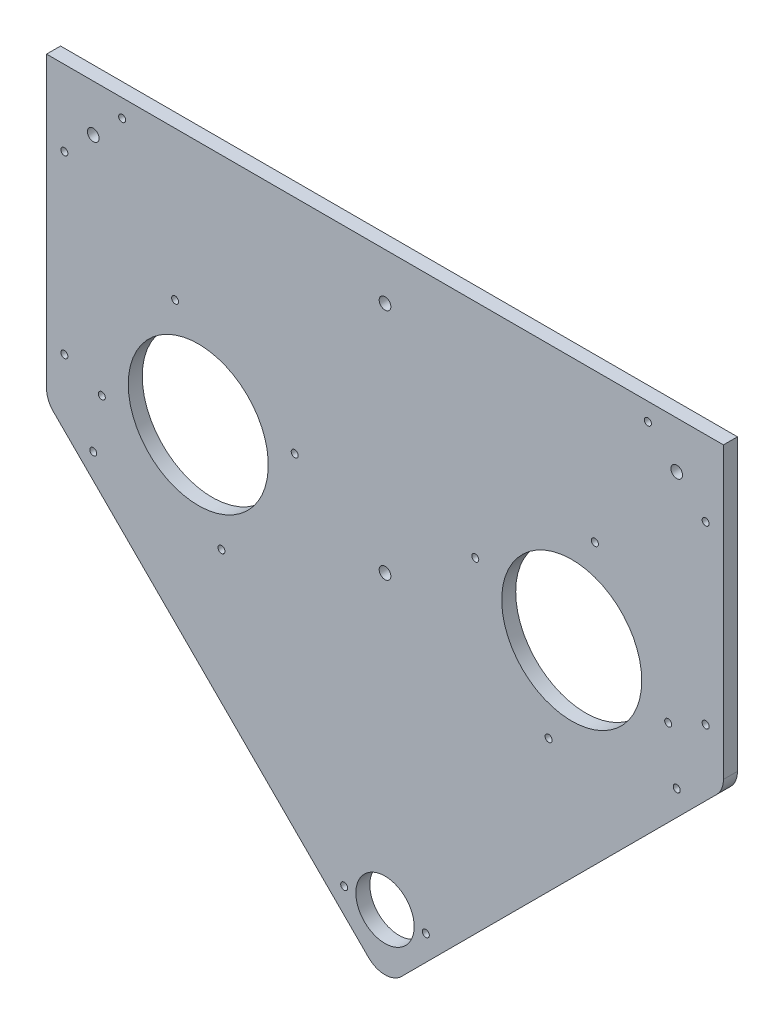
ISO-10303-21;
HEADER;
FILE_DESCRIPTION(('STEP AP214'),'2;1');
FILE_NAME('part.step','',(''),(''),'','','');
FILE_SCHEMA(('AUTOMOTIVE_DESIGN { 1 0 10303 214 1 1 1 1 }'));
ENDSEC;
DATA;
#1=APPLICATION_CONTEXT('core data for automotive mechanical design processes');
#2=APPLICATION_PROTOCOL_DEFINITION('international standard','automotive_design',2000,#1);
#3=PRODUCT_CONTEXT('',#1,'mechanical');
#4=PRODUCT('Part','Part','',(#3));
#5=PRODUCT_RELATED_PRODUCT_CATEGORY('part','',(#4));
#6=PRODUCT_DEFINITION_FORMATION('','',#4);
#7=PRODUCT_DEFINITION_CONTEXT('part definition',#1,'design');
#8=PRODUCT_DEFINITION('design','',#6,#7);
#9=PRODUCT_DEFINITION_SHAPE('','',#8);
#10=(LENGTH_UNIT() NAMED_UNIT(*) SI_UNIT(.MILLI.,.METRE.));
#11=(NAMED_UNIT(*) PLANE_ANGLE_UNIT() SI_UNIT($,.RADIAN.));
#12=(NAMED_UNIT(*) SI_UNIT($,.STERADIAN.) SOLID_ANGLE_UNIT());
#13=UNCERTAINTY_MEASURE_WITH_UNIT(LENGTH_MEASURE(1.E-05),#10,'distance_accuracy_value','');
#14=(GEOMETRIC_REPRESENTATION_CONTEXT(3) GLOBAL_UNCERTAINTY_ASSIGNED_CONTEXT((#13)) GLOBAL_UNIT_ASSIGNED_CONTEXT((#10,
#11,#12)) REPRESENTATION_CONTEXT('',''));
#15=CARTESIAN_POINT('',(0.,0.,0.));
#16=DIRECTION('',(0.,0.,1.));
#17=DIRECTION('',(1.,0.,0.));
#18=AXIS2_PLACEMENT_3D('',#15,#16,#17);
#19=CARTESIAN_POINT('',(0.,0.,6.));
#20=DIRECTION('',(0.,0.,-1.));
#21=DIRECTION('',(-1.,0.,0.));
#22=AXIS2_PLACEMENT_3D('',#19,#20,#21);
#23=PLANE('',#22);
#24=CARTESIAN_POINT('',(80.,15.,6.));
#25=DIRECTION('',(0.,0.,1.));
#26=DIRECTION('',(1.,0.,0.));
#27=AXIS2_PLACEMENT_3D('',#24,#25,#26);
#28=CIRCLE('',#27,30.);
#29=CARTESIAN_POINT('',(110.,15.,6.));
#30=VERTEX_POINT('',#29);
#31=EDGE_CURVE('E582',#30,#30,#28,.T.);
#32=ORIENTED_EDGE('',*,*,#31,.F.);
#33=EDGE_LOOP('',(#32));
#34=FACE_BOUND('',#33,.T.);
#35=CARTESIAN_POINT('',(-89.9203681970796,56.3259760300271,6.));
#36=DIRECTION('',(0.,0.,1.));
#37=DIRECTION('',(-1.,0.,0.));
#38=AXIS2_PLACEMENT_3D('',#35,#36,#37);
#39=CIRCLE('',#38,1.50000000000003);
#40=CARTESIAN_POINT('',(-91.4203681970796,56.3259760300271,6.));
#41=VERTEX_POINT('',#40);
#42=EDGE_CURVE('E580',#41,#41,#39,.T.);
#43=ORIENTED_EDGE('',*,*,#42,.F.);
#44=EDGE_LOOP('',(#43));
#45=FACE_BOUND('',#44,.T.);
#46=CARTESIAN_POINT('',(-70.0796318029204,-26.3259760300271,6.));
#47=DIRECTION('',(0.,0.,1.));
#48=DIRECTION('',(-1.,0.,0.));
#49=AXIS2_PLACEMENT_3D('',#46,#47,#48);
#50=CIRCLE('',#49,1.5);
#51=CARTESIAN_POINT('',(-71.5796318029204,-26.3259760300271,6.));
#52=VERTEX_POINT('',#51);
#53=EDGE_CURVE('E575',#52,#52,#50,.T.);
#54=ORIENTED_EDGE('',*,*,#53,.F.);
#55=EDGE_LOOP('',(#54));
#56=FACE_BOUND('',#55,.T.);
#57=CARTESIAN_POINT('',(-121.325976030027,5.07963180292047,6.));
#58=DIRECTION('',(0.,0.,1.));
#59=DIRECTION('',(-1.,0.,0.));
#60=AXIS2_PLACEMENT_3D('',#57,#58,#59);
#61=CIRCLE('',#60,1.5);
#62=CARTESIAN_POINT('',(-122.825976030027,5.07963180292047,6.));
#63=VERTEX_POINT('',#62);
#64=EDGE_CURVE('E571',#63,#63,#61,.T.);
#65=ORIENTED_EDGE('',*,*,#64,.F.);
#66=EDGE_LOOP('',(#65));
#67=FACE_BOUND('',#66,.T.);
#68=CARTESIAN_POINT('',(38.6740239699729,24.9203681970796,6.));
#69=DIRECTION('',(0.,0.,1.));
#70=DIRECTION('',(1.,0.,0.));
#71=AXIS2_PLACEMENT_3D('',#68,#69,#70);
#72=CIRCLE('',#71,1.50000000000003);
#73=CARTESIAN_POINT('',(40.1740239699729,24.9203681970796,6.));
#74=VERTEX_POINT('',#73);
#75=EDGE_CURVE('E598',#74,#74,#72,.T.);
#76=ORIENTED_EDGE('',*,*,#75,.F.);
#77=EDGE_LOOP('',(#76));
#78=FACE_BOUND('',#77,.T.);
#79=CARTESIAN_POINT('',(121.325976030027,5.07963180292047,6.));
#80=DIRECTION('',(0.,0.,1.));
#81=DIRECTION('',(1.,0.,0.));
#82=AXIS2_PLACEMENT_3D('',#79,#80,#81);
#83=CIRCLE('',#82,1.5);
#84=CARTESIAN_POINT('',(122.825976030027,5.07963180292047,6.));
#85=VERTEX_POINT('',#84);
#86=EDGE_CURVE('E594',#85,#85,#83,.T.);
#87=ORIENTED_EDGE('',*,*,#86,.F.);
#88=EDGE_LOOP('',(#87));
#89=FACE_BOUND('',#88,.T.);
#90=CARTESIAN_POINT('',(70.0796318029204,-26.3259760300271,6.));
#91=DIRECTION('',(0.,0.,1.));
#92=DIRECTION('',(1.,0.,0.));
#93=AXIS2_PLACEMENT_3D('',#90,#91,#92);
#94=CIRCLE('',#93,1.5);
#95=CARTESIAN_POINT('',(71.5796318029204,-26.3259760300271,6.));
#96=VERTEX_POINT('',#95);
#97=EDGE_CURVE('E590',#96,#96,#94,.T.);
#98=ORIENTED_EDGE('',*,*,#97,.F.);
#99=EDGE_LOOP('',(#98));
#100=FACE_BOUND('',#99,.T.);
#101=CARTESIAN_POINT('',(-38.6740239699729,24.9203681970796,6.));
#102=DIRECTION('',(0.,0.,1.));
#103=DIRECTION('',(-1.,0.,0.));
#104=AXIS2_PLACEMENT_3D('',#101,#102,#103);
#105=CIRCLE('',#104,1.50000000000003);
#106=CARTESIAN_POINT('',(-40.1740239699729,24.9203681970796,6.));
#107=VERTEX_POINT('',#106);
#108=EDGE_CURVE('E586',#107,#107,#105,.T.);
#109=ORIENTED_EDGE('',*,*,#108,.F.);
#110=EDGE_LOOP('',(#109));
#111=FACE_BOUND('',#110,.T.);
#112=CARTESIAN_POINT('',(-80.,15.,6.));
#113=DIRECTION('',(0.,0.,1.));
#114=DIRECTION('',(-1.,0.,0.));
#115=AXIS2_PLACEMENT_3D('',#112,#113,#114);
#116=CIRCLE('',#115,30.);
#117=CARTESIAN_POINT('',(-110.,15.,6.));
#118=VERTEX_POINT('',#117);
#119=EDGE_CURVE('E568',#118,#118,#116,.T.);
#120=ORIENTED_EDGE('',*,*,#119,.F.);
#121=EDGE_LOOP('',(#120));
#122=FACE_BOUND('',#121,.T.);
#123=CARTESIAN_POINT('',(89.9203681970796,56.3259760300271,6.));
#124=DIRECTION('',(0.,0.,1.));
#125=DIRECTION('',(1.,0.,0.));
#126=AXIS2_PLACEMENT_3D('',#123,#124,#125);
#127=CIRCLE('',#126,1.50000000000003);
#128=CARTESIAN_POINT('',(91.4203681970796,56.3259760300271,6.));
#129=VERTEX_POINT('',#128);
#130=EDGE_CURVE('E198',#129,#129,#127,.T.);
#131=ORIENTED_EDGE('',*,*,#130,.F.);
#132=EDGE_LOOP('',(#131));
#133=FACE_BOUND('',#132,.T.);
#134=DIRECTION('',(0.,-1.,0.));
#135=VECTOR('',#134,1.);
#136=CARTESIAN_POINT('',(-145.,-8.28427124746189,6.));
#137=LINE('',#136,#135);
#138=CARTESIAN_POINT('',(-145.,120.,6.));
#139=VERTEX_POINT('',#138);
#140=CARTESIAN_POINT('',(-145.,-4.14213562373095,6.));
#141=VERTEX_POINT('',#140);
#142=EDGE_CURVE('E159',#139,#141,#137,.T.);
#143=ORIENTED_EDGE('',*,*,#142,.T.);
#144=CARTESIAN_POINT('',(-135.,-4.14213562373095,6.));
#145=DIRECTION('',(0.,0.,-1.));
#146=DIRECTION('',(-1.,0.,0.));
#147=AXIS2_PLACEMENT_3D('',#144,#145,#146);
#148=CIRCLE('',#147,10.);
#149=CARTESIAN_POINT('',(-142.071067811865,-11.2132034355965,6.));
#150=VERTEX_POINT('',#149);
#151=EDGE_CURVE('E184',#141,#150,#148,.F.);
#152=ORIENTED_EDGE('',*,*,#151,.T.);
#153=DIRECTION('',(0.707106781186547,-0.707106781186547,0.));
#154=VECTOR('',#153,1.);
#155=CARTESIAN_POINT('',(0.,-153.284271247462,6.));
#156=LINE('',#155,#154);
#157=CARTESIAN_POINT('',(-7.07106781186548,-146.213203435596,6.));
#158=VERTEX_POINT('',#157);
#159=EDGE_CURVE('E359',#150,#158,#156,.T.);
#160=ORIENTED_EDGE('',*,*,#159,.T.);
#161=CARTESIAN_POINT('',(0.,-139.142135623731,6.));
#162=DIRECTION('',(0.,0.,-1.));
#163=DIRECTION('',(-1.,0.,0.));
#164=AXIS2_PLACEMENT_3D('',#161,#162,#163);
#165=CIRCLE('',#164,10.);
#166=CARTESIAN_POINT('',(7.07106781186545,-146.213203435596,6.));
#167=VERTEX_POINT('',#166);
#168=EDGE_CURVE('E179',#158,#167,#165,.F.);
#169=ORIENTED_EDGE('',*,*,#168,.T.);
#170=DIRECTION('',(0.707106781186548,0.707106781186547,0.));
#171=VECTOR('',#170,1.);
#172=CARTESIAN_POINT('',(145.,-8.28427124746206,6.));
#173=LINE('',#172,#171);
#174=CARTESIAN_POINT('',(142.071067811865,-11.2132034355966,6.));
#175=VERTEX_POINT('',#174);
#176=EDGE_CURVE('E121',#167,#175,#173,.T.);
#177=ORIENTED_EDGE('',*,*,#176,.T.);
#178=CARTESIAN_POINT('',(135.,-4.14213562373111,6.));
#179=DIRECTION('',(0.,0.,-1.));
#180=DIRECTION('',(-1.,0.,0.));
#181=AXIS2_PLACEMENT_3D('',#178,#179,#180);
#182=CIRCLE('',#181,10.);
#183=CARTESIAN_POINT('',(145.,-4.14213562373111,6.));
#184=VERTEX_POINT('',#183);
#185=EDGE_CURVE('E63',#175,#184,#182,.F.);
#186=ORIENTED_EDGE('',*,*,#185,.T.);
#187=DIRECTION('',(0.,1.,0.));
#188=VECTOR('',#187,1.);
#189=CARTESIAN_POINT('',(145.,120.,6.));
#190=LINE('',#189,#188);
#191=CARTESIAN_POINT('',(145.,120.,6.));
#192=VERTEX_POINT('',#191);
#193=EDGE_CURVE('E110',#184,#192,#190,.T.);
#194=ORIENTED_EDGE('',*,*,#193,.T.);
#195=DIRECTION('',(-1.,0.,0.));
#196=VECTOR('',#195,1.);
#197=CARTESIAN_POINT('',(-145.,120.,6.));
#198=LINE('',#197,#196);
#199=EDGE_CURVE('E115',#192,#139,#198,.T.);
#200=ORIENTED_EDGE('',*,*,#199,.T.);
#201=EDGE_LOOP('',(#143,#152,#160,#169,#177,#186,#194,#200));
#202=FACE_BOUND('',#201,.T.);
#203=CARTESIAN_POINT('',(-125.,100.,6.));
#204=DIRECTION('',(0.,0.,1.));
#205=DIRECTION('',(1.,0.,0.));
#206=AXIS2_PLACEMENT_3D('',#203,#204,#205);
#207=CIRCLE('',#206,2.5);
#208=CARTESIAN_POINT('',(-122.5,100.,6.));
#209=VERTEX_POINT('',#208);
#210=EDGE_CURVE('E148',#209,#209,#207,.T.);
#211=ORIENTED_EDGE('',*,*,#210,.F.);
#212=EDGE_LOOP('',(#211));
#213=FACE_BOUND('',#212,.T.);
#214=CARTESIAN_POINT('',(125.,100.,6.));
#215=DIRECTION('',(0.,0.,1.));
#216=DIRECTION('',(1.,0.,0.));
#217=AXIS2_PLACEMENT_3D('',#214,#215,#216);
#218=CIRCLE('',#217,2.49999999999998);
#219=CARTESIAN_POINT('',(127.5,100.,6.));
#220=VERTEX_POINT('',#219);
#221=EDGE_CURVE('E343',#220,#220,#218,.T.);
#222=ORIENTED_EDGE('',*,*,#221,.F.);
#223=EDGE_LOOP('',(#222));
#224=FACE_BOUND('',#223,.T.);
#225=CARTESIAN_POINT('',(0.,-125.,6.));
#226=DIRECTION('',(0.,0.,1.));
#227=DIRECTION('',(1.,0.,0.));
#228=AXIS2_PLACEMENT_3D('',#225,#226,#227);
#229=CIRCLE('',#228,12.5);
#230=CARTESIAN_POINT('',(12.5,-125.,6.));
#231=VERTEX_POINT('',#230);
#232=EDGE_CURVE('E335',#231,#231,#229,.T.);
#233=ORIENTED_EDGE('',*,*,#232,.F.);
#234=EDGE_LOOP('',(#233));
#235=FACE_BOUND('',#234,.T.);
#236=CARTESIAN_POINT('',(-112.625631329235,112.374368670765,6.));
#237=DIRECTION('',(0.,0.,1.));
#238=DIRECTION('',(1.,0.,0.));
#239=AXIS2_PLACEMENT_3D('',#236,#237,#238);
#240=CIRCLE('',#239,1.5);
#241=CARTESIAN_POINT('',(-111.125631329235,112.374368670765,6.));
#242=VERTEX_POINT('',#241);
#243=EDGE_CURVE('E327',#242,#242,#240,.T.);
#244=ORIENTED_EDGE('',*,*,#243,.F.);
#245=EDGE_LOOP('',(#244));
#246=FACE_BOUND('',#245,.T.);
#247=CARTESIAN_POINT('',(-137.374368670765,87.6256313292354,6.));
#248=DIRECTION('',(0.,0.,1.));
#249=DIRECTION('',(1.,0.,0.));
#250=AXIS2_PLACEMENT_3D('',#247,#248,#249);
#251=CIRCLE('',#250,1.5);
#252=CARTESIAN_POINT('',(-135.874368670765,87.6256313292354,6.));
#253=VERTEX_POINT('',#252);
#254=EDGE_CURVE('E319',#253,#253,#251,.T.);
#255=ORIENTED_EDGE('',*,*,#254,.F.);
#256=EDGE_LOOP('',(#255));
#257=FACE_BOUND('',#256,.T.);
#258=CARTESIAN_POINT('',(-137.374368670765,12.3743686707647,6.));
#259=DIRECTION('',(0.,0.,1.));
#260=DIRECTION('',(1.,0.,0.));
#261=AXIS2_PLACEMENT_3D('',#258,#259,#260);
#262=CIRCLE('',#261,1.5);
#263=CARTESIAN_POINT('',(-135.874368670765,12.3743686707647,6.));
#264=VERTEX_POINT('',#263);
#265=EDGE_CURVE('E311',#264,#264,#262,.T.);
#266=ORIENTED_EDGE('',*,*,#265,.F.);
#267=EDGE_LOOP('',(#266));
#268=FACE_BOUND('',#267,.T.);
#269=CARTESIAN_POINT('',(-125.,-17.5,6.));
#270=DIRECTION('',(0.,0.,1.));
#271=DIRECTION('',(1.,0.,0.));
#272=AXIS2_PLACEMENT_3D('',#269,#270,#271);
#273=CIRCLE('',#272,1.5);
#274=CARTESIAN_POINT('',(-123.5,-17.5,6.));
#275=VERTEX_POINT('',#274);
#276=EDGE_CURVE('E303',#275,#275,#273,.T.);
#277=ORIENTED_EDGE('',*,*,#276,.F.);
#278=EDGE_LOOP('',(#277));
#279=FACE_BOUND('',#278,.T.);
#280=CARTESIAN_POINT('',(-17.5,-125.,6.));
#281=DIRECTION('',(0.,0.,1.));
#282=DIRECTION('',(1.,0.,0.));
#283=AXIS2_PLACEMENT_3D('',#280,#281,#282);
#284=CIRCLE('',#283,1.5);
#285=CARTESIAN_POINT('',(-16.,-125.,6.));
#286=VERTEX_POINT('',#285);
#287=EDGE_CURVE('E295',#286,#286,#284,.T.);
#288=ORIENTED_EDGE('',*,*,#287,.F.);
#289=EDGE_LOOP('',(#288));
#290=FACE_BOUND('',#289,.T.);
#291=CARTESIAN_POINT('',(17.5,-125.,6.));
#292=DIRECTION('',(0.,0.,1.));
#293=DIRECTION('',(-1.,0.,0.));
#294=AXIS2_PLACEMENT_3D('',#291,#292,#293);
#295=CIRCLE('',#294,1.5);
#296=CARTESIAN_POINT('',(16.,-125.,6.));
#297=VERTEX_POINT('',#296);
#298=EDGE_CURVE('E287',#297,#297,#295,.T.);
#299=ORIENTED_EDGE('',*,*,#298,.F.);
#300=EDGE_LOOP('',(#299));
#301=FACE_BOUND('',#300,.T.);
#302=CARTESIAN_POINT('',(125.,-17.5,6.));
#303=DIRECTION('',(0.,0.,1.));
#304=DIRECTION('',(-1.,0.,0.));
#305=AXIS2_PLACEMENT_3D('',#302,#303,#304);
#306=CIRCLE('',#305,1.5);
#307=CARTESIAN_POINT('',(123.5,-17.5,6.));
#308=VERTEX_POINT('',#307);
#309=EDGE_CURVE('E279',#308,#308,#306,.T.);
#310=ORIENTED_EDGE('',*,*,#309,.F.);
#311=EDGE_LOOP('',(#310));
#312=FACE_BOUND('',#311,.T.);
#313=CARTESIAN_POINT('',(137.374368670765,12.3743686707647,6.));
#314=DIRECTION('',(0.,0.,1.));
#315=DIRECTION('',(-1.,0.,0.));
#316=AXIS2_PLACEMENT_3D('',#313,#314,#315);
#317=CIRCLE('',#316,1.5);
#318=CARTESIAN_POINT('',(135.874368670765,12.3743686707647,6.));
#319=VERTEX_POINT('',#318);
#320=EDGE_CURVE('E271',#319,#319,#317,.T.);
#321=ORIENTED_EDGE('',*,*,#320,.F.);
#322=EDGE_LOOP('',(#321));
#323=FACE_BOUND('',#322,.T.);
#324=CARTESIAN_POINT('',(137.374368670765,87.6256313292354,6.));
#325=DIRECTION('',(0.,0.,1.));
#326=DIRECTION('',(-1.,0.,0.));
#327=AXIS2_PLACEMENT_3D('',#324,#325,#326);
#328=CIRCLE('',#327,1.5);
#329=CARTESIAN_POINT('',(135.874368670765,87.6256313292354,6.));
#330=VERTEX_POINT('',#329);
#331=EDGE_CURVE('E263',#330,#330,#328,.T.);
#332=ORIENTED_EDGE('',*,*,#331,.F.);
#333=EDGE_LOOP('',(#332));
#334=FACE_BOUND('',#333,.T.);
#335=CARTESIAN_POINT('',(112.625631329235,112.374368670765,6.));
#336=DIRECTION('',(0.,0.,1.));
#337=DIRECTION('',(-1.,0.,0.));
#338=AXIS2_PLACEMENT_3D('',#335,#336,#337);
#339=CIRCLE('',#338,1.5);
#340=CARTESIAN_POINT('',(111.125631329235,112.374368670765,6.));
#341=VERTEX_POINT('',#340);
#342=EDGE_CURVE('E255',#341,#341,#339,.T.);
#343=ORIENTED_EDGE('',*,*,#342,.F.);
#344=EDGE_LOOP('',(#343));
#345=FACE_BOUND('',#344,.T.);
#346=CARTESIAN_POINT('',(0.,100.,6.));
#347=DIRECTION('',(0.,0.,1.));
#348=DIRECTION('',(1.,0.,0.));
#349=AXIS2_PLACEMENT_3D('',#346,#347,#348);
#350=CIRCLE('',#349,2.5);
#351=CARTESIAN_POINT('',(2.5,100.,6.));
#352=VERTEX_POINT('',#351);
#353=EDGE_CURVE('E247',#352,#352,#350,.T.);
#354=ORIENTED_EDGE('',*,*,#353,.F.);
#355=EDGE_LOOP('',(#354));
#356=FACE_BOUND('',#355,.T.);
#357=CARTESIAN_POINT('',(0.,0.,6.));
#358=DIRECTION('',(0.,0.,1.));
#359=DIRECTION('',(1.,0.,0.));
#360=AXIS2_PLACEMENT_3D('',#357,#358,#359);
#361=CIRCLE('',#360,2.5);
#362=CARTESIAN_POINT('',(2.5,0.,6.));
#363=VERTEX_POINT('',#362);
#364=EDGE_CURVE('E237',#363,#363,#361,.T.);
#365=ORIENTED_EDGE('',*,*,#364,.F.);
#366=EDGE_LOOP('',(#365));
#367=FACE_BOUND('',#366,.T.);
#368=ADVANCED_FACE('F45',(#34,#45,#56,#67,#78,#89,#100,#111,#122,#133,#202,#213,#224,#235,#246,
#257,#268,#279,#290,#301,#312,#323,#334,#345,#356,#367),#23,.F.);
#369=CARTESIAN_POINT('',(0.,0.,0.));
#370=DIRECTION('',(0.,0.,-1.));
#371=DIRECTION('',(-1.,0.,0.));
#372=AXIS2_PLACEMENT_3D('',#369,#370,#371);
#373=PLANE('',#372);
#374=CARTESIAN_POINT('',(80.,15.,0.));
#375=DIRECTION('',(0.,0.,-1.));
#376=DIRECTION('',(-1.,0.,0.));
#377=AXIS2_PLACEMENT_3D('',#374,#375,#376);
#378=CIRCLE('',#377,30.);
#379=CARTESIAN_POINT('',(50.,15.,0.));
#380=VERTEX_POINT('',#379);
#381=EDGE_CURVE('E49',#380,#380,#378,.T.);
#382=ORIENTED_EDGE('',*,*,#381,.F.);
#383=EDGE_LOOP('',(#382));
#384=FACE_BOUND('',#383,.T.);
#385=CARTESIAN_POINT('',(-89.9203681970796,56.3259760300271,0.));
#386=DIRECTION('',(0.,0.,-1.));
#387=DIRECTION('',(-1.,0.,0.));
#388=AXIS2_PLACEMENT_3D('',#385,#386,#387);
#389=CIRCLE('',#388,1.50000000000003);
#390=CARTESIAN_POINT('',(-91.4203681970796,56.3259760300271,0.));
#391=VERTEX_POINT('',#390);
#392=EDGE_CURVE('E225',#391,#391,#389,.T.);
#393=ORIENTED_EDGE('',*,*,#392,.F.);
#394=EDGE_LOOP('',(#393));
#395=FACE_BOUND('',#394,.T.);
#396=CARTESIAN_POINT('',(-70.0796318029204,-26.3259760300271,0.));
#397=DIRECTION('',(0.,0.,-1.));
#398=DIRECTION('',(-1.,0.,0.));
#399=AXIS2_PLACEMENT_3D('',#396,#397,#398);
#400=CIRCLE('',#399,1.5);
#401=CARTESIAN_POINT('',(-71.5796318029204,-26.3259760300271,0.));
#402=VERTEX_POINT('',#401);
#403=EDGE_CURVE('E222',#402,#402,#400,.T.);
#404=ORIENTED_EDGE('',*,*,#403,.F.);
#405=EDGE_LOOP('',(#404));
#406=FACE_BOUND('',#405,.T.);
#407=CARTESIAN_POINT('',(-121.325976030027,5.07963180292047,0.));
#408=DIRECTION('',(0.,0.,-1.));
#409=DIRECTION('',(-1.,0.,0.));
#410=AXIS2_PLACEMENT_3D('',#407,#408,#409);
#411=CIRCLE('',#410,1.5);
#412=CARTESIAN_POINT('',(-122.825976030027,5.07963180292047,0.));
#413=VERTEX_POINT('',#412);
#414=EDGE_CURVE('E218',#413,#413,#411,.T.);
#415=ORIENTED_EDGE('',*,*,#414,.F.);
#416=EDGE_LOOP('',(#415));
#417=FACE_BOUND('',#416,.T.);
#418=CARTESIAN_POINT('',(38.6740239699729,24.9203681970796,0.));
#419=DIRECTION('',(0.,0.,-1.));
#420=DIRECTION('',(-1.,0.,0.));
#421=AXIS2_PLACEMENT_3D('',#418,#419,#420);
#422=CIRCLE('',#421,1.50000000000003);
#423=CARTESIAN_POINT('',(37.1740239699729,24.9203681970796,0.));
#424=VERTEX_POINT('',#423);
#425=EDGE_CURVE('E214',#424,#424,#422,.T.);
#426=ORIENTED_EDGE('',*,*,#425,.F.);
#427=EDGE_LOOP('',(#426));
#428=FACE_BOUND('',#427,.T.);
#429=CARTESIAN_POINT('',(121.325976030027,5.07963180292047,0.));
#430=DIRECTION('',(0.,0.,-1.));
#431=DIRECTION('',(-1.,0.,0.));
#432=AXIS2_PLACEMENT_3D('',#429,#430,#431);
#433=CIRCLE('',#432,1.5);
#434=CARTESIAN_POINT('',(119.825976030027,5.07963180292047,0.));
#435=VERTEX_POINT('',#434);
#436=EDGE_CURVE('E210',#435,#435,#433,.T.);
#437=ORIENTED_EDGE('',*,*,#436,.F.);
#438=EDGE_LOOP('',(#437));
#439=FACE_BOUND('',#438,.T.);
#440=CARTESIAN_POINT('',(70.0796318029204,-26.3259760300271,0.));
#441=DIRECTION('',(0.,0.,-1.));
#442=DIRECTION('',(-1.,0.,0.));
#443=AXIS2_PLACEMENT_3D('',#440,#441,#442);
#444=CIRCLE('',#443,1.5);
#445=CARTESIAN_POINT('',(68.5796318029204,-26.3259760300271,0.));
#446=VERTEX_POINT('',#445);
#447=EDGE_CURVE('E206',#446,#446,#444,.T.);
#448=ORIENTED_EDGE('',*,*,#447,.F.);
#449=EDGE_LOOP('',(#448));
#450=FACE_BOUND('',#449,.T.);
#451=CARTESIAN_POINT('',(-38.6740239699729,24.9203681970796,0.));
#452=DIRECTION('',(0.,0.,-1.));
#453=DIRECTION('',(-1.,0.,0.));
#454=AXIS2_PLACEMENT_3D('',#451,#452,#453);
#455=CIRCLE('',#454,1.50000000000003);
#456=CARTESIAN_POINT('',(-40.1740239699729,24.9203681970796,0.));
#457=VERTEX_POINT('',#456);
#458=EDGE_CURVE('E202',#457,#457,#455,.T.);
#459=ORIENTED_EDGE('',*,*,#458,.F.);
#460=EDGE_LOOP('',(#459));
#461=FACE_BOUND('',#460,.T.);
#462=CARTESIAN_POINT('',(-80.,15.,0.));
#463=DIRECTION('',(0.,0.,-1.));
#464=DIRECTION('',(-1.,0.,0.));
#465=AXIS2_PLACEMENT_3D('',#462,#463,#464);
#466=CIRCLE('',#465,30.);
#467=CARTESIAN_POINT('',(-110.,15.,0.));
#468=VERTEX_POINT('',#467);
#469=EDGE_CURVE('E197',#468,#468,#466,.T.);
#470=ORIENTED_EDGE('',*,*,#469,.F.);
#471=EDGE_LOOP('',(#470));
#472=FACE_BOUND('',#471,.T.);
#473=CARTESIAN_POINT('',(89.9203681970796,56.3259760300271,0.));
#474=DIRECTION('',(0.,0.,-1.));
#475=DIRECTION('',(-1.,0.,0.));
#476=AXIS2_PLACEMENT_3D('',#473,#474,#475);
#477=CIRCLE('',#476,1.50000000000003);
#478=CARTESIAN_POINT('',(88.4203681970795,56.3259760300271,0.));
#479=VERTEX_POINT('',#478);
#480=EDGE_CURVE('E193',#479,#479,#477,.T.);
#481=ORIENTED_EDGE('',*,*,#480,.F.);
#482=EDGE_LOOP('',(#481));
#483=FACE_BOUND('',#482,.T.);
#484=CARTESIAN_POINT('',(0.,100.,0.));
#485=DIRECTION('',(0.,0.,1.));
#486=DIRECTION('',(1.,0.,0.));
#487=AXIS2_PLACEMENT_3D('',#484,#485,#486);
#488=CIRCLE('',#487,2.5);
#489=CARTESIAN_POINT('',(2.5,100.,0.));
#490=VERTEX_POINT('',#489);
#491=EDGE_CURVE('E243',#490,#490,#488,.T.);
#492=ORIENTED_EDGE('',*,*,#491,.T.);
#493=EDGE_LOOP('',(#492));
#494=FACE_BOUND('',#493,.T.);
#495=CARTESIAN_POINT('',(137.374368670765,87.6256313292354,0.));
#496=DIRECTION('',(0.,0.,1.));
#497=DIRECTION('',(-1.,0.,0.));
#498=AXIS2_PLACEMENT_3D('',#495,#496,#497);
#499=CIRCLE('',#498,1.5);
#500=CARTESIAN_POINT('',(135.874368670765,87.6256313292354,0.));
#501=VERTEX_POINT('',#500);
#502=EDGE_CURVE('E259',#501,#501,#499,.T.);
#503=ORIENTED_EDGE('',*,*,#502,.T.);
#504=EDGE_LOOP('',(#503));
#505=FACE_BOUND('',#504,.T.);
#506=CARTESIAN_POINT('',(125.,-17.5,0.));
#507=DIRECTION('',(0.,0.,1.));
#508=DIRECTION('',(-1.,0.,0.));
#509=AXIS2_PLACEMENT_3D('',#506,#507,#508);
#510=CIRCLE('',#509,1.5);
#511=CARTESIAN_POINT('',(123.5,-17.5,0.));
#512=VERTEX_POINT('',#511);
#513=EDGE_CURVE('E275',#512,#512,#510,.T.);
#514=ORIENTED_EDGE('',*,*,#513,.T.);
#515=EDGE_LOOP('',(#514));
#516=FACE_BOUND('',#515,.T.);
#517=CARTESIAN_POINT('',(-17.5,-125.,0.));
#518=DIRECTION('',(0.,0.,1.));
#519=DIRECTION('',(1.,0.,0.));
#520=AXIS2_PLACEMENT_3D('',#517,#518,#519);
#521=CIRCLE('',#520,1.5);
#522=CARTESIAN_POINT('',(-16.,-125.,0.));
#523=VERTEX_POINT('',#522);
#524=EDGE_CURVE('E291',#523,#523,#521,.T.);
#525=ORIENTED_EDGE('',*,*,#524,.T.);
#526=EDGE_LOOP('',(#525));
#527=FACE_BOUND('',#526,.T.);
#528=CARTESIAN_POINT('',(-137.374368670765,12.3743686707647,0.));
#529=DIRECTION('',(0.,0.,1.));
#530=DIRECTION('',(1.,0.,0.));
#531=AXIS2_PLACEMENT_3D('',#528,#529,#530);
#532=CIRCLE('',#531,1.5);
#533=CARTESIAN_POINT('',(-135.874368670765,12.3743686707647,0.));
#534=VERTEX_POINT('',#533);
#535=EDGE_CURVE('E307',#534,#534,#532,.T.);
#536=ORIENTED_EDGE('',*,*,#535,.T.);
#537=EDGE_LOOP('',(#536));
#538=FACE_BOUND('',#537,.T.);
#539=CARTESIAN_POINT('',(-112.625631329235,112.374368670765,0.));
#540=DIRECTION('',(0.,0.,1.));
#541=DIRECTION('',(1.,0.,0.));
#542=AXIS2_PLACEMENT_3D('',#539,#540,#541);
#543=CIRCLE('',#542,1.5);
#544=CARTESIAN_POINT('',(-111.125631329235,112.374368670765,0.));
#545=VERTEX_POINT('',#544);
#546=EDGE_CURVE('E323',#545,#545,#543,.T.);
#547=ORIENTED_EDGE('',*,*,#546,.T.);
#548=EDGE_LOOP('',(#547));
#549=FACE_BOUND('',#548,.T.);
#550=CARTESIAN_POINT('',(125.,100.,0.));
#551=DIRECTION('',(0.,0.,1.));
#552=DIRECTION('',(1.,0.,0.));
#553=AXIS2_PLACEMENT_3D('',#550,#551,#552);
#554=CIRCLE('',#553,2.49999999999998);
#555=CARTESIAN_POINT('',(127.5,100.,0.));
#556=VERTEX_POINT('',#555);
#557=EDGE_CURVE('E339',#556,#556,#554,.T.);
#558=ORIENTED_EDGE('',*,*,#557,.T.);
#559=EDGE_LOOP('',(#558));
#560=FACE_BOUND('',#559,.T.);
#561=DIRECTION('',(0.707106781186547,-0.707106781186547,0.));
#562=VECTOR('',#561,1.);
#563=CARTESIAN_POINT('',(0.,-153.284271247462,0.));
#564=LINE('',#563,#562);
#565=CARTESIAN_POINT('',(-142.071067811865,-11.2132034355965,0.));
#566=VERTEX_POINT('',#565);
#567=CARTESIAN_POINT('',(-7.07106781186548,-146.213203435596,0.));
#568=VERTEX_POINT('',#567);
#569=EDGE_CURVE('E147',#566,#568,#564,.T.);
#570=ORIENTED_EDGE('',*,*,#569,.F.);
#571=CARTESIAN_POINT('',(-135.,-4.14213562373095,0.));
#572=DIRECTION('',(0.,0.,-1.));
#573=DIRECTION('',(-1.,0.,0.));
#574=AXIS2_PLACEMENT_3D('',#571,#572,#573);
#575=CIRCLE('',#574,10.);
#576=CARTESIAN_POINT('',(-145.,-4.14213562373095,0.));
#577=VERTEX_POINT('',#576);
#578=EDGE_CURVE('E173',#566,#577,#575,.T.);
#579=ORIENTED_EDGE('',*,*,#578,.T.);
#580=DIRECTION('',(0.,-1.,0.));
#581=VECTOR('',#580,1.);
#582=CARTESIAN_POINT('',(-145.,-8.28427124746189,0.));
#583=LINE('',#582,#581);
#584=CARTESIAN_POINT('',(-145.,120.,0.));
#585=VERTEX_POINT('',#584);
#586=EDGE_CURVE('E143',#585,#577,#583,.T.);
#587=ORIENTED_EDGE('',*,*,#586,.F.);
#588=DIRECTION('',(-1.,0.,0.));
#589=VECTOR('',#588,1.);
#590=CARTESIAN_POINT('',(-145.,120.,0.));
#591=LINE('',#590,#589);
#592=CARTESIAN_POINT('',(145.,120.,0.));
#593=VERTEX_POINT('',#592);
#594=EDGE_CURVE('E157',#593,#585,#591,.T.);
#595=ORIENTED_EDGE('',*,*,#594,.F.);
#596=DIRECTION('',(0.,1.,0.));
#597=VECTOR('',#596,1.);
#598=CARTESIAN_POINT('',(145.,120.,0.));
#599=LINE('',#598,#597);
#600=CARTESIAN_POINT('',(145.,-4.14213562373111,0.));
#601=VERTEX_POINT('',#600);
#602=EDGE_CURVE('E127',#601,#593,#599,.T.);
#603=ORIENTED_EDGE('',*,*,#602,.F.);
#604=CARTESIAN_POINT('',(135.,-4.14213562373111,0.));
#605=DIRECTION('',(0.,0.,-1.));
#606=DIRECTION('',(-1.,0.,0.));
#607=AXIS2_PLACEMENT_3D('',#604,#605,#606);
#608=CIRCLE('',#607,10.);
#609=CARTESIAN_POINT('',(142.071067811865,-11.2132034355966,0.));
#610=VERTEX_POINT('',#609);
#611=EDGE_CURVE('E170',#601,#610,#608,.T.);
#612=ORIENTED_EDGE('',*,*,#611,.T.);
#613=DIRECTION('',(0.707106781186548,0.707106781186547,0.));
#614=VECTOR('',#613,1.);
#615=CARTESIAN_POINT('',(145.,-8.28427124746206,0.));
#616=LINE('',#615,#614);
#617=CARTESIAN_POINT('',(7.07106781186545,-146.213203435596,0.));
#618=VERTEX_POINT('',#617);
#619=EDGE_CURVE('E152',#618,#610,#616,.T.);
#620=ORIENTED_EDGE('',*,*,#619,.F.);
#621=CARTESIAN_POINT('',(0.,-139.142135623731,0.));
#622=DIRECTION('',(0.,0.,-1.));
#623=DIRECTION('',(-1.,0.,0.));
#624=AXIS2_PLACEMENT_3D('',#621,#622,#623);
#625=CIRCLE('',#624,10.);
#626=EDGE_CURVE('E167',#618,#568,#625,.T.);
#627=ORIENTED_EDGE('',*,*,#626,.T.);
#628=EDGE_LOOP('',(#570,#579,#587,#595,#603,#612,#620,#627));
#629=FACE_BOUND('',#628,.T.);
#630=CARTESIAN_POINT('',(-125.,100.,0.));
#631=DIRECTION('',(0.,0.,1.));
#632=DIRECTION('',(1.,0.,0.));
#633=AXIS2_PLACEMENT_3D('',#630,#631,#632);
#634=CIRCLE('',#633,2.5);
#635=CARTESIAN_POINT('',(-122.5,100.,0.));
#636=VERTEX_POINT('',#635);
#637=EDGE_CURVE('E347',#636,#636,#634,.T.);
#638=ORIENTED_EDGE('',*,*,#637,.T.);
#639=EDGE_LOOP('',(#638));
#640=FACE_BOUND('',#639,.T.);
#641=CARTESIAN_POINT('',(0.,-125.,0.));
#642=DIRECTION('',(0.,0.,1.));
#643=DIRECTION('',(1.,0.,0.));
#644=AXIS2_PLACEMENT_3D('',#641,#642,#643);
#645=CIRCLE('',#644,12.5);
#646=CARTESIAN_POINT('',(12.5,-125.,0.));
#647=VERTEX_POINT('',#646);
#648=EDGE_CURVE('E331',#647,#647,#645,.T.);
#649=ORIENTED_EDGE('',*,*,#648,.T.);
#650=EDGE_LOOP('',(#649));
#651=FACE_BOUND('',#650,.T.);
#652=CARTESIAN_POINT('',(-137.374368670765,87.6256313292354,0.));
#653=DIRECTION('',(0.,0.,1.));
#654=DIRECTION('',(1.,0.,0.));
#655=AXIS2_PLACEMENT_3D('',#652,#653,#654);
#656=CIRCLE('',#655,1.5);
#657=CARTESIAN_POINT('',(-135.874368670765,87.6256313292354,0.));
#658=VERTEX_POINT('',#657);
#659=EDGE_CURVE('E315',#658,#658,#656,.T.);
#660=ORIENTED_EDGE('',*,*,#659,.T.);
#661=EDGE_LOOP('',(#660));
#662=FACE_BOUND('',#661,.T.);
#663=CARTESIAN_POINT('',(-125.,-17.5,0.));
#664=DIRECTION('',(0.,0.,1.));
#665=DIRECTION('',(1.,0.,0.));
#666=AXIS2_PLACEMENT_3D('',#663,#664,#665);
#667=CIRCLE('',#666,1.5);
#668=CARTESIAN_POINT('',(-123.5,-17.5,0.));
#669=VERTEX_POINT('',#668);
#670=EDGE_CURVE('E299',#669,#669,#667,.T.);
#671=ORIENTED_EDGE('',*,*,#670,.T.);
#672=EDGE_LOOP('',(#671));
#673=FACE_BOUND('',#672,.T.);
#674=CARTESIAN_POINT('',(17.5,-125.,0.));
#675=DIRECTION('',(0.,0.,1.));
#676=DIRECTION('',(-1.,0.,0.));
#677=AXIS2_PLACEMENT_3D('',#674,#675,#676);
#678=CIRCLE('',#677,1.5);
#679=CARTESIAN_POINT('',(16.,-125.,0.));
#680=VERTEX_POINT('',#679);
#681=EDGE_CURVE('E283',#680,#680,#678,.T.);
#682=ORIENTED_EDGE('',*,*,#681,.T.);
#683=EDGE_LOOP('',(#682));
#684=FACE_BOUND('',#683,.T.);
#685=CARTESIAN_POINT('',(137.374368670765,12.3743686707647,0.));
#686=DIRECTION('',(0.,0.,1.));
#687=DIRECTION('',(-1.,0.,0.));
#688=AXIS2_PLACEMENT_3D('',#685,#686,#687);
#689=CIRCLE('',#688,1.5);
#690=CARTESIAN_POINT('',(135.874368670765,12.3743686707647,0.));
#691=VERTEX_POINT('',#690);
#692=EDGE_CURVE('E267',#691,#691,#689,.T.);
#693=ORIENTED_EDGE('',*,*,#692,.T.);
#694=EDGE_LOOP('',(#693));
#695=FACE_BOUND('',#694,.T.);
#696=CARTESIAN_POINT('',(112.625631329235,112.374368670765,0.));
#697=DIRECTION('',(0.,0.,1.));
#698=DIRECTION('',(-1.,0.,0.));
#699=AXIS2_PLACEMENT_3D('',#696,#697,#698);
#700=CIRCLE('',#699,1.5);
#701=CARTESIAN_POINT('',(111.125631329235,112.374368670765,0.));
#702=VERTEX_POINT('',#701);
#703=EDGE_CURVE('E251',#702,#702,#700,.T.);
#704=ORIENTED_EDGE('',*,*,#703,.T.);
#705=EDGE_LOOP('',(#704));
#706=FACE_BOUND('',#705,.T.);
#707=CARTESIAN_POINT('',(0.,0.,0.));
#708=DIRECTION('',(0.,0.,1.));
#709=DIRECTION('',(1.,0.,0.));
#710=AXIS2_PLACEMENT_3D('',#707,#708,#709);
#711=CIRCLE('',#710,2.5);
#712=CARTESIAN_POINT('',(2.5,0.,0.));
#713=VERTEX_POINT('',#712);
#714=EDGE_CURVE('E232',#713,#713,#711,.T.);
#715=ORIENTED_EDGE('',*,*,#714,.T.);
#716=EDGE_LOOP('',(#715));
#717=FACE_BOUND('',#716,.T.);
#718=ADVANCED_FACE('F369',(#384,#395,#406,#417,#428,#439,#450,#461,#472,#483,#494,#505,#516,
#527,#538,#549,#560,#629,#640,#651,#662,#673,#684,#695,#706,#717),#373,.T.);
#719=CARTESIAN_POINT('',(-145.,-8.28427124746189,6.));
#720=DIRECTION('',(1.,0.,0.));
#721=DIRECTION('',(0.,0.,-1.));
#722=AXIS2_PLACEMENT_3D('',#719,#720,#721);
#723=PLANE('',#722);
#724=ORIENTED_EDGE('',*,*,#586,.T.);
#725=DIRECTION('',(0.,0.,-1.));
#726=VECTOR('',#725,1.);
#727=CARTESIAN_POINT('',(-145.,-4.14213562373095,6.));
#728=LINE('',#727,#726);
#729=EDGE_CURVE('E176',#577,#141,#728,.F.);
#730=ORIENTED_EDGE('',*,*,#729,.T.);
#731=ORIENTED_EDGE('',*,*,#142,.F.);
#732=DIRECTION('',(0.,0.,-1.));
#733=VECTOR('',#732,1.);
#734=CARTESIAN_POINT('',(-145.,120.,6.));
#735=LINE('',#734,#733);
#736=EDGE_CURVE('E132',#139,#585,#735,.T.);
#737=ORIENTED_EDGE('',*,*,#736,.T.);
#738=EDGE_LOOP('',(#724,#730,#731,#737));
#739=FACE_BOUND('',#738,.T.);
#740=ADVANCED_FACE('F374',(#739),#723,.F.);
#741=CARTESIAN_POINT('',(0.,-153.284271247462,6.));
#742=DIRECTION('',(0.707106781186547,0.707106781186548,0.));
#743=DIRECTION('',(-0.707106781186548,0.707106781186547,0.));
#744=AXIS2_PLACEMENT_3D('',#741,#742,#743);
#745=PLANE('',#744);
#746=ORIENTED_EDGE('',*,*,#159,.F.);
#747=DIRECTION('',(0.,0.,-1.));
#748=VECTOR('',#747,1.);
#749=CARTESIAN_POINT('',(-142.071067811865,-11.2132034355964,6.));
#750=LINE('',#749,#748);
#751=EDGE_CURVE('E163',#150,#566,#750,.T.);
#752=ORIENTED_EDGE('',*,*,#751,.T.);
#753=ORIENTED_EDGE('',*,*,#569,.T.);
#754=DIRECTION('',(0.,0.,-1.));
#755=VECTOR('',#754,1.);
#756=CARTESIAN_POINT('',(-7.07106781186548,-146.213203435596,6.));
#757=LINE('',#756,#755);
#758=EDGE_CURVE('E131',#568,#158,#757,.F.);
#759=ORIENTED_EDGE('',*,*,#758,.T.);
#760=EDGE_LOOP('',(#746,#752,#753,#759));
#761=FACE_BOUND('',#760,.T.);
#762=ADVANCED_FACE('F382',(#761),#745,.F.);
#763=CARTESIAN_POINT('',(145.,-8.28427124746206,6.));
#764=DIRECTION('',(-0.707106781186547,0.707106781186548,0.));
#765=DIRECTION('',(-0.707106781186548,-0.707106781186547,0.));
#766=AXIS2_PLACEMENT_3D('',#763,#764,#765);
#767=PLANE('',#766);
#768=ORIENTED_EDGE('',*,*,#619,.T.);
#769=DIRECTION('',(0.,0.,-1.));
#770=VECTOR('',#769,1.);
#771=CARTESIAN_POINT('',(142.071067811865,-11.2132034355966,6.));
#772=LINE('',#771,#770);
#773=EDGE_CURVE('E11',#610,#175,#772,.F.);
#774=ORIENTED_EDGE('',*,*,#773,.T.);
#775=ORIENTED_EDGE('',*,*,#176,.F.);
#776=DIRECTION('',(0.,0.,-1.));
#777=VECTOR('',#776,1.);
#778=CARTESIAN_POINT('',(7.07106781186548,-146.213203435596,6.));
#779=LINE('',#778,#777);
#780=EDGE_CURVE('E55',#167,#618,#779,.T.);
#781=ORIENTED_EDGE('',*,*,#780,.T.);
#782=EDGE_LOOP('',(#768,#774,#775,#781));
#783=FACE_BOUND('',#782,.T.);
#784=ADVANCED_FACE('F385',(#783),#767,.F.);
#785=CARTESIAN_POINT('',(145.,120.,6.));
#786=DIRECTION('',(-1.,0.,0.));
#787=DIRECTION('',(0.,0.,1.));
#788=AXIS2_PLACEMENT_3D('',#785,#786,#787);
#789=PLANE('',#788);
#790=ORIENTED_EDGE('',*,*,#193,.F.);
#791=DIRECTION('',(0.,0.,-1.));
#792=VECTOR('',#791,1.);
#793=CARTESIAN_POINT('',(145.,-4.14213562373111,6.));
#794=LINE('',#793,#792);
#795=EDGE_CURVE('E187',#184,#601,#794,.T.);
#796=ORIENTED_EDGE('',*,*,#795,.T.);
#797=ORIENTED_EDGE('',*,*,#602,.T.);
#798=DIRECTION('',(0.,0.,-1.));
#799=VECTOR('',#798,1.);
#800=CARTESIAN_POINT('',(145.,120.,6.));
#801=LINE('',#800,#799);
#802=EDGE_CURVE('E124',#192,#593,#801,.T.);
#803=ORIENTED_EDGE('',*,*,#802,.F.);
#804=EDGE_LOOP('',(#790,#796,#797,#803));
#805=FACE_BOUND('',#804,.T.);
#806=ADVANCED_FACE('F125',(#805),#789,.F.);
#807=CARTESIAN_POINT('',(-145.,120.,6.));
#808=DIRECTION('',(0.,-1.,0.));
#809=DIRECTION('',(0.,0.,-1.));
#810=AXIS2_PLACEMENT_3D('',#807,#808,#809);
#811=PLANE('',#810);
#812=ORIENTED_EDGE('',*,*,#594,.T.);
#813=ORIENTED_EDGE('',*,*,#736,.F.);
#814=ORIENTED_EDGE('',*,*,#199,.F.);
#815=ORIENTED_EDGE('',*,*,#802,.T.);
#816=EDGE_LOOP('',(#812,#813,#814,#815));
#817=FACE_BOUND('',#816,.T.);
#818=ADVANCED_FACE('F134',(#817),#811,.F.);
#819=CARTESIAN_POINT('',(-125.,100.,6.));
#820=DIRECTION('',(0.,0.,-1.));
#821=DIRECTION('',(-1.,0.,0.));
#822=AXIS2_PLACEMENT_3D('',#819,#820,#821);
#823=CYLINDRICAL_SURFACE('',#822,2.5);
#824=ORIENTED_EDGE('',*,*,#210,.T.);
#825=EDGE_LOOP('',(#824));
#826=FACE_BOUND('',#825,.T.);
#827=ORIENTED_EDGE('',*,*,#637,.F.);
#828=EDGE_LOOP('',(#827));
#829=FACE_BOUND('',#828,.T.);
#830=ADVANCED_FACE('F406',(#826,#829),#823,.F.);
#831=CARTESIAN_POINT('',(125.,100.,6.));
#832=DIRECTION('',(0.,0.,-1.));
#833=DIRECTION('',(-1.,0.,0.));
#834=AXIS2_PLACEMENT_3D('',#831,#832,#833);
#835=CYLINDRICAL_SURFACE('',#834,2.49999999999998);
#836=ORIENTED_EDGE('',*,*,#221,.T.);
#837=EDGE_LOOP('',(#836));
#838=FACE_BOUND('',#837,.T.);
#839=ORIENTED_EDGE('',*,*,#557,.F.);
#840=EDGE_LOOP('',(#839));
#841=FACE_BOUND('',#840,.T.);
#842=ADVANCED_FACE('F413',(#838,#841),#835,.F.);
#843=CARTESIAN_POINT('',(0.,-125.,6.));
#844=DIRECTION('',(0.,0.,-1.));
#845=DIRECTION('',(-1.,0.,0.));
#846=AXIS2_PLACEMENT_3D('',#843,#844,#845);
#847=CYLINDRICAL_SURFACE('',#846,12.5);
#848=ORIENTED_EDGE('',*,*,#232,.T.);
#849=EDGE_LOOP('',(#848));
#850=FACE_BOUND('',#849,.T.);
#851=ORIENTED_EDGE('',*,*,#648,.F.);
#852=EDGE_LOOP('',(#851));
#853=FACE_BOUND('',#852,.T.);
#854=ADVANCED_FACE('F418',(#850,#853),#847,.F.);
#855=CARTESIAN_POINT('',(-112.625631329235,112.374368670765,6.));
#856=DIRECTION('',(0.,0.,-1.));
#857=DIRECTION('',(-1.,0.,0.));
#858=AXIS2_PLACEMENT_3D('',#855,#856,#857);
#859=CYLINDRICAL_SURFACE('',#858,1.5);
#860=ORIENTED_EDGE('',*,*,#243,.T.);
#861=EDGE_LOOP('',(#860));
#862=FACE_BOUND('',#861,.T.);
#863=ORIENTED_EDGE('',*,*,#546,.F.);
#864=EDGE_LOOP('',(#863));
#865=FACE_BOUND('',#864,.T.);
#866=ADVANCED_FACE('F480',(#862,#865),#859,.F.);
#867=CARTESIAN_POINT('',(-137.374368670765,87.6256313292354,6.));
#868=DIRECTION('',(0.,0.,-1.));
#869=DIRECTION('',(-1.,0.,0.));
#870=AXIS2_PLACEMENT_3D('',#867,#868,#869);
#871=CYLINDRICAL_SURFACE('',#870,1.5);
#872=ORIENTED_EDGE('',*,*,#254,.T.);
#873=EDGE_LOOP('',(#872));
#874=FACE_BOUND('',#873,.T.);
#875=ORIENTED_EDGE('',*,*,#659,.F.);
#876=EDGE_LOOP('',(#875));
#877=FACE_BOUND('',#876,.T.);
#878=ADVANCED_FACE('F476',(#874,#877),#871,.F.);
#879=CARTESIAN_POINT('',(-137.374368670765,12.3743686707647,6.));
#880=DIRECTION('',(0.,0.,-1.));
#881=DIRECTION('',(-1.,0.,0.));
#882=AXIS2_PLACEMENT_3D('',#879,#880,#881);
#883=CYLINDRICAL_SURFACE('',#882,1.5);
#884=ORIENTED_EDGE('',*,*,#265,.T.);
#885=EDGE_LOOP('',(#884));
#886=FACE_BOUND('',#885,.T.);
#887=ORIENTED_EDGE('',*,*,#535,.F.);
#888=EDGE_LOOP('',(#887));
#889=FACE_BOUND('',#888,.T.);
#890=ADVANCED_FACE('F472',(#886,#889),#883,.F.);
#891=CARTESIAN_POINT('',(-125.,-17.5,6.));
#892=DIRECTION('',(0.,0.,-1.));
#893=DIRECTION('',(-1.,0.,0.));
#894=AXIS2_PLACEMENT_3D('',#891,#892,#893);
#895=CYLINDRICAL_SURFACE('',#894,1.5);
#896=ORIENTED_EDGE('',*,*,#276,.T.);
#897=EDGE_LOOP('',(#896));
#898=FACE_BOUND('',#897,.T.);
#899=ORIENTED_EDGE('',*,*,#670,.F.);
#900=EDGE_LOOP('',(#899));
#901=FACE_BOUND('',#900,.T.);
#902=ADVANCED_FACE('F468',(#898,#901),#895,.F.);
#903=CARTESIAN_POINT('',(-17.5,-125.,6.));
#904=DIRECTION('',(0.,0.,-1.));
#905=DIRECTION('',(-1.,0.,0.));
#906=AXIS2_PLACEMENT_3D('',#903,#904,#905);
#907=CYLINDRICAL_SURFACE('',#906,1.5);
#908=ORIENTED_EDGE('',*,*,#287,.T.);
#909=EDGE_LOOP('',(#908));
#910=FACE_BOUND('',#909,.T.);
#911=ORIENTED_EDGE('',*,*,#524,.F.);
#912=EDGE_LOOP('',(#911));
#913=FACE_BOUND('',#912,.T.);
#914=ADVANCED_FACE('F464',(#910,#913),#907,.F.);
#915=CARTESIAN_POINT('',(17.5,-125.,6.));
#916=DIRECTION('',(0.,0.,-1.));
#917=DIRECTION('',(-1.,0.,0.));
#918=AXIS2_PLACEMENT_3D('',#915,#916,#917);
#919=CYLINDRICAL_SURFACE('',#918,1.5);
#920=ORIENTED_EDGE('',*,*,#298,.T.);
#921=EDGE_LOOP('',(#920));
#922=FACE_BOUND('',#921,.T.);
#923=ORIENTED_EDGE('',*,*,#681,.F.);
#924=EDGE_LOOP('',(#923));
#925=FACE_BOUND('',#924,.T.);
#926=ADVANCED_FACE('F460',(#922,#925),#919,.F.);
#927=CARTESIAN_POINT('',(125.,-17.5,6.));
#928=DIRECTION('',(0.,0.,-1.));
#929=DIRECTION('',(-1.,0.,0.));
#930=AXIS2_PLACEMENT_3D('',#927,#928,#929);
#931=CYLINDRICAL_SURFACE('',#930,1.5);
#932=ORIENTED_EDGE('',*,*,#309,.T.);
#933=EDGE_LOOP('',(#932));
#934=FACE_BOUND('',#933,.T.);
#935=ORIENTED_EDGE('',*,*,#513,.F.);
#936=EDGE_LOOP('',(#935));
#937=FACE_BOUND('',#936,.T.);
#938=ADVANCED_FACE('F456',(#934,#937),#931,.F.);
#939=CARTESIAN_POINT('',(137.374368670765,12.3743686707647,6.));
#940=DIRECTION('',(0.,0.,-1.));
#941=DIRECTION('',(-1.,0.,0.));
#942=AXIS2_PLACEMENT_3D('',#939,#940,#941);
#943=CYLINDRICAL_SURFACE('',#942,1.5);
#944=ORIENTED_EDGE('',*,*,#320,.T.);
#945=EDGE_LOOP('',(#944));
#946=FACE_BOUND('',#945,.T.);
#947=ORIENTED_EDGE('',*,*,#692,.F.);
#948=EDGE_LOOP('',(#947));
#949=FACE_BOUND('',#948,.T.);
#950=ADVANCED_FACE('F449',(#946,#949),#943,.F.);
#951=CARTESIAN_POINT('',(137.374368670765,87.6256313292354,6.));
#952=DIRECTION('',(0.,0.,-1.));
#953=DIRECTION('',(-1.,0.,0.));
#954=AXIS2_PLACEMENT_3D('',#951,#952,#953);
#955=CYLINDRICAL_SURFACE('',#954,1.5);
#956=ORIENTED_EDGE('',*,*,#331,.T.);
#957=EDGE_LOOP('',(#956));
#958=FACE_BOUND('',#957,.T.);
#959=ORIENTED_EDGE('',*,*,#502,.F.);
#960=EDGE_LOOP('',(#959));
#961=FACE_BOUND('',#960,.T.);
#962=ADVANCED_FACE('F439',(#958,#961),#955,.F.);
#963=CARTESIAN_POINT('',(112.625631329235,112.374368670765,6.));
#964=DIRECTION('',(0.,0.,-1.));
#965=DIRECTION('',(-1.,0.,0.));
#966=AXIS2_PLACEMENT_3D('',#963,#964,#965);
#967=CYLINDRICAL_SURFACE('',#966,1.5);
#968=ORIENTED_EDGE('',*,*,#342,.T.);
#969=EDGE_LOOP('',(#968));
#970=FACE_BOUND('',#969,.T.);
#971=ORIENTED_EDGE('',*,*,#703,.F.);
#972=EDGE_LOOP('',(#971));
#973=FACE_BOUND('',#972,.T.);
#974=ADVANCED_FACE('F436',(#970,#973),#967,.F.);
#975=CARTESIAN_POINT('',(0.,100.,6.));
#976=DIRECTION('',(0.,0.,-1.));
#977=DIRECTION('',(-1.,0.,0.));
#978=AXIS2_PLACEMENT_3D('',#975,#976,#977);
#979=CYLINDRICAL_SURFACE('',#978,2.5);
#980=ORIENTED_EDGE('',*,*,#353,.T.);
#981=EDGE_LOOP('',(#980));
#982=FACE_BOUND('',#981,.T.);
#983=ORIENTED_EDGE('',*,*,#491,.F.);
#984=EDGE_LOOP('',(#983));
#985=FACE_BOUND('',#984,.T.);
#986=ADVANCED_FACE('F438',(#982,#985),#979,.F.);
#987=CARTESIAN_POINT('',(0.,0.,6.));
#988=DIRECTION('',(0.,0.,-1.));
#989=DIRECTION('',(-1.,0.,0.));
#990=AXIS2_PLACEMENT_3D('',#987,#988,#989);
#991=CYLINDRICAL_SURFACE('',#990,2.5);
#992=ORIENTED_EDGE('',*,*,#364,.T.);
#993=EDGE_LOOP('',(#992));
#994=FACE_BOUND('',#993,.T.);
#995=ORIENTED_EDGE('',*,*,#714,.F.);
#996=EDGE_LOOP('',(#995));
#997=FACE_BOUND('',#996,.T.);
#998=ADVANCED_FACE('F446',(#994,#997),#991,.F.);
#999=CARTESIAN_POINT('',(-135.,-4.14213562373095,6.));
#1000=DIRECTION('',(0.,0.,-1.));
#1001=DIRECTION('',(-1.,0.,0.));
#1002=AXIS2_PLACEMENT_3D('',#999,#1000,#1001);
#1003=CYLINDRICAL_SURFACE('',#1002,10.);
#1004=ORIENTED_EDGE('',*,*,#151,.F.);
#1005=ORIENTED_EDGE('',*,*,#729,.F.);
#1006=ORIENTED_EDGE('',*,*,#578,.F.);
#1007=ORIENTED_EDGE('',*,*,#751,.F.);
#1008=EDGE_LOOP('',(#1004,#1005,#1006,#1007));
#1009=FACE_BOUND('',#1008,.T.);
#1010=ADVANCED_FACE('F380',(#1009),#1003,.T.);
#1011=CARTESIAN_POINT('',(135.,-4.14213562373111,6.));
#1012=DIRECTION('',(0.,0.,-1.));
#1013=DIRECTION('',(-1.,0.,0.));
#1014=AXIS2_PLACEMENT_3D('',#1011,#1012,#1013);
#1015=CYLINDRICAL_SURFACE('',#1014,10.);
#1016=ORIENTED_EDGE('',*,*,#185,.F.);
#1017=ORIENTED_EDGE('',*,*,#773,.F.);
#1018=ORIENTED_EDGE('',*,*,#611,.F.);
#1019=ORIENTED_EDGE('',*,*,#795,.F.);
#1020=EDGE_LOOP('',(#1016,#1017,#1018,#1019));
#1021=FACE_BOUND('',#1020,.T.);
#1022=ADVANCED_FACE('F366',(#1021),#1015,.T.);
#1023=CARTESIAN_POINT('',(0.,-139.142135623731,6.));
#1024=DIRECTION('',(0.,0.,-1.));
#1025=DIRECTION('',(-1.,0.,0.));
#1026=AXIS2_PLACEMENT_3D('',#1023,#1024,#1025);
#1027=CYLINDRICAL_SURFACE('',#1026,10.);
#1028=ORIENTED_EDGE('',*,*,#168,.F.);
#1029=ORIENTED_EDGE('',*,*,#758,.F.);
#1030=ORIENTED_EDGE('',*,*,#626,.F.);
#1031=ORIENTED_EDGE('',*,*,#780,.F.);
#1032=EDGE_LOOP('',(#1028,#1029,#1030,#1031));
#1033=FACE_BOUND('',#1032,.T.);
#1034=ADVANCED_FACE('F47',(#1033),#1027,.T.);
#1035=CARTESIAN_POINT('',(89.9203681970796,56.3259760300271,-4.));
#1036=DIRECTION('',(0.,0.,1.));
#1037=DIRECTION('',(1.,0.,0.));
#1038=AXIS2_PLACEMENT_3D('',#1035,#1036,#1037);
#1039=CYLINDRICAL_SURFACE('',#1038,1.50000000000003);
#1040=ORIENTED_EDGE('',*,*,#480,.T.);
#1041=EDGE_LOOP('',(#1040));
#1042=FACE_BOUND('',#1041,.T.);
#1043=ORIENTED_EDGE('',*,*,#130,.T.);
#1044=EDGE_LOOP('',(#1043));
#1045=FACE_BOUND('',#1044,.T.);
#1046=ADVANCED_FACE('F525',(#1042,#1045),#1039,.F.);
#1047=CARTESIAN_POINT('',(-80.,15.,-4.));
#1048=DIRECTION('',(0.,0.,1.));
#1049=DIRECTION('',(1.,0.,0.));
#1050=AXIS2_PLACEMENT_3D('',#1047,#1048,#1049);
#1051=CYLINDRICAL_SURFACE('',#1050,30.);
#1052=ORIENTED_EDGE('',*,*,#469,.T.);
#1053=EDGE_LOOP('',(#1052));
#1054=FACE_BOUND('',#1053,.T.);
#1055=ORIENTED_EDGE('',*,*,#119,.T.);
#1056=EDGE_LOOP('',(#1055));
#1057=FACE_BOUND('',#1056,.T.);
#1058=ADVANCED_FACE('F528',(#1054,#1057),#1051,.F.);
#1059=CARTESIAN_POINT('',(-38.6740239699729,24.9203681970796,-4.));
#1060=DIRECTION('',(0.,0.,1.));
#1061=DIRECTION('',(1.,0.,0.));
#1062=AXIS2_PLACEMENT_3D('',#1059,#1060,#1061);
#1063=CYLINDRICAL_SURFACE('',#1062,1.50000000000003);
#1064=ORIENTED_EDGE('',*,*,#458,.T.);
#1065=EDGE_LOOP('',(#1064));
#1066=FACE_BOUND('',#1065,.T.);
#1067=ORIENTED_EDGE('',*,*,#108,.T.);
#1068=EDGE_LOOP('',(#1067));
#1069=FACE_BOUND('',#1068,.T.);
#1070=ADVANCED_FACE('F540',(#1066,#1069),#1063,.F.);
#1071=CARTESIAN_POINT('',(70.0796318029204,-26.3259760300271,-4.));
#1072=DIRECTION('',(0.,0.,1.));
#1073=DIRECTION('',(1.,0.,0.));
#1074=AXIS2_PLACEMENT_3D('',#1071,#1072,#1073);
#1075=CYLINDRICAL_SURFACE('',#1074,1.5);
#1076=ORIENTED_EDGE('',*,*,#447,.T.);
#1077=EDGE_LOOP('',(#1076));
#1078=FACE_BOUND('',#1077,.T.);
#1079=ORIENTED_EDGE('',*,*,#97,.T.);
#1080=EDGE_LOOP('',(#1079));
#1081=FACE_BOUND('',#1080,.T.);
#1082=ADVANCED_FACE('F534',(#1078,#1081),#1075,.F.);
#1083=CARTESIAN_POINT('',(121.325976030027,5.07963180292047,-4.));
#1084=DIRECTION('',(0.,0.,1.));
#1085=DIRECTION('',(1.,0.,0.));
#1086=AXIS2_PLACEMENT_3D('',#1083,#1084,#1085);
#1087=CYLINDRICAL_SURFACE('',#1086,1.5);
#1088=ORIENTED_EDGE('',*,*,#436,.T.);
#1089=EDGE_LOOP('',(#1088));
#1090=FACE_BOUND('',#1089,.T.);
#1091=ORIENTED_EDGE('',*,*,#86,.T.);
#1092=EDGE_LOOP('',(#1091));
#1093=FACE_BOUND('',#1092,.T.);
#1094=ADVANCED_FACE('F530',(#1090,#1093),#1087,.F.);
#1095=CARTESIAN_POINT('',(38.6740239699729,24.9203681970796,-4.));
#1096=DIRECTION('',(0.,0.,1.));
#1097=DIRECTION('',(1.,0.,0.));
#1098=AXIS2_PLACEMENT_3D('',#1095,#1096,#1097);
#1099=CYLINDRICAL_SURFACE('',#1098,1.50000000000003);
#1100=ORIENTED_EDGE('',*,*,#425,.T.);
#1101=EDGE_LOOP('',(#1100));
#1102=FACE_BOUND('',#1101,.T.);
#1103=ORIENTED_EDGE('',*,*,#75,.T.);
#1104=EDGE_LOOP('',(#1103));
#1105=FACE_BOUND('',#1104,.T.);
#1106=ADVANCED_FACE('F533',(#1102,#1105),#1099,.F.);
#1107=CARTESIAN_POINT('',(-121.325976030027,5.07963180292047,-4.));
#1108=DIRECTION('',(0.,0.,1.));
#1109=DIRECTION('',(1.,0.,0.));
#1110=AXIS2_PLACEMENT_3D('',#1107,#1108,#1109);
#1111=CYLINDRICAL_SURFACE('',#1110,1.5);
#1112=ORIENTED_EDGE('',*,*,#414,.T.);
#1113=EDGE_LOOP('',(#1112));
#1114=FACE_BOUND('',#1113,.T.);
#1115=ORIENTED_EDGE('',*,*,#64,.T.);
#1116=EDGE_LOOP('',(#1115));
#1117=FACE_BOUND('',#1116,.T.);
#1118=ADVANCED_FACE('F538',(#1114,#1117),#1111,.F.);
#1119=CARTESIAN_POINT('',(-70.0796318029204,-26.3259760300271,-4.));
#1120=DIRECTION('',(0.,0.,1.));
#1121=DIRECTION('',(1.,0.,0.));
#1122=AXIS2_PLACEMENT_3D('',#1119,#1120,#1121);
#1123=CYLINDRICAL_SURFACE('',#1122,1.5);
#1124=ORIENTED_EDGE('',*,*,#403,.T.);
#1125=EDGE_LOOP('',(#1124));
#1126=FACE_BOUND('',#1125,.T.);
#1127=ORIENTED_EDGE('',*,*,#53,.T.);
#1128=EDGE_LOOP('',(#1127));
#1129=FACE_BOUND('',#1128,.T.);
#1130=ADVANCED_FACE('F551',(#1126,#1129),#1123,.F.);
#1131=CARTESIAN_POINT('',(-89.9203681970796,56.3259760300271,-4.));
#1132=DIRECTION('',(0.,0.,1.));
#1133=DIRECTION('',(1.,0.,0.));
#1134=AXIS2_PLACEMENT_3D('',#1131,#1132,#1133);
#1135=CYLINDRICAL_SURFACE('',#1134,1.50000000000003);
#1136=ORIENTED_EDGE('',*,*,#392,.T.);
#1137=EDGE_LOOP('',(#1136));
#1138=FACE_BOUND('',#1137,.T.);
#1139=ORIENTED_EDGE('',*,*,#42,.T.);
#1140=EDGE_LOOP('',(#1139));
#1141=FACE_BOUND('',#1140,.T.);
#1142=ADVANCED_FACE('F547',(#1138,#1141),#1135,.F.);
#1143=CARTESIAN_POINT('',(80.,15.,-4.));
#1144=DIRECTION('',(0.,0.,1.));
#1145=DIRECTION('',(1.,0.,0.));
#1146=AXIS2_PLACEMENT_3D('',#1143,#1144,#1145);
#1147=CYLINDRICAL_SURFACE('',#1146,30.);
#1148=ORIENTED_EDGE('',*,*,#381,.T.);
#1149=EDGE_LOOP('',(#1148));
#1150=FACE_BOUND('',#1149,.T.);
#1151=ORIENTED_EDGE('',*,*,#31,.T.);
#1152=EDGE_LOOP('',(#1151));
#1153=FACE_BOUND('',#1152,.T.);
#1154=ADVANCED_FACE('F550',(#1150,#1153),#1147,.F.);
#1155=CLOSED_SHELL('',(#368,#718,#740,#762,#784,#806,#818,#830,#842,#854,#866,#878,#890,#902,
#914,#926,#938,#950,#962,#974,#986,#998,#1010,#1022,#1034,#1046,#1058,#1070,#1082,#1094,#1106,
#1118,#1130,#1142,#1154));
#1156=MANIFOLD_SOLID_BREP('B2',#1155);
#1157=ADVANCED_BREP_SHAPE_REPRESENTATION('',(#18,#1156),#14);
#1158=SHAPE_DEFINITION_REPRESENTATION(#9,#1157);
ENDSEC;
END-ISO-10303-21;
